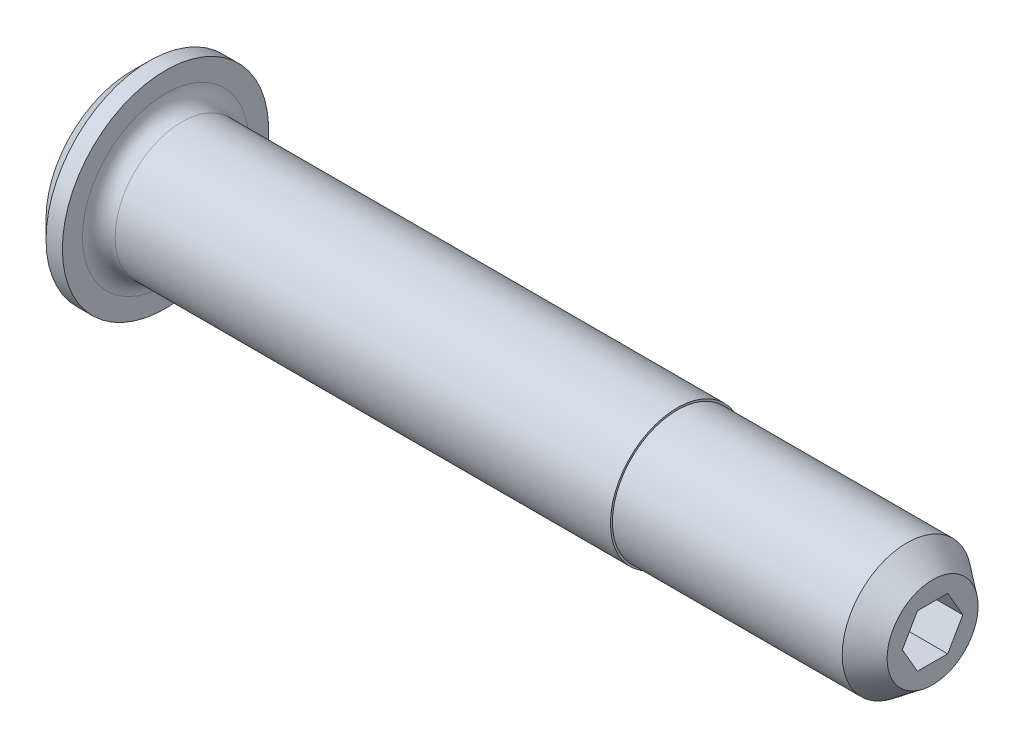
ISO-10303-21;
HEADER;
FILE_DESCRIPTION(('STEP AP214'),'2;1');
FILE_NAME('part.step','',(''),(''),'','','');
FILE_SCHEMA(('AUTOMOTIVE_DESIGN { 1 0 10303 214 1 1 1 1 }'));
ENDSEC;
DATA;
#1=APPLICATION_CONTEXT('core data for automotive mechanical design processes');
#2=APPLICATION_PROTOCOL_DEFINITION('international standard','automotive_design',2000,#1);
#3=PRODUCT_CONTEXT('',#1,'mechanical');
#4=PRODUCT('Part','Part','',(#3));
#5=PRODUCT_RELATED_PRODUCT_CATEGORY('part','',(#4));
#6=PRODUCT_DEFINITION_FORMATION('','',#4);
#7=PRODUCT_DEFINITION_CONTEXT('part definition',#1,'design');
#8=PRODUCT_DEFINITION('design','',#6,#7);
#9=PRODUCT_DEFINITION_SHAPE('','',#8);
#10=(LENGTH_UNIT() NAMED_UNIT(*) SI_UNIT(.MILLI.,.METRE.));
#11=(NAMED_UNIT(*) PLANE_ANGLE_UNIT() SI_UNIT($,.RADIAN.));
#12=(NAMED_UNIT(*) SI_UNIT($,.STERADIAN.) SOLID_ANGLE_UNIT());
#13=UNCERTAINTY_MEASURE_WITH_UNIT(LENGTH_MEASURE(1.E-05),#10,'distance_accuracy_value','');
#14=(GEOMETRIC_REPRESENTATION_CONTEXT(3) GLOBAL_UNCERTAINTY_ASSIGNED_CONTEXT((#13)) GLOBAL_UNIT_ASSIGNED_CONTEXT((#10,
#11,#12)) REPRESENTATION_CONTEXT('',''));
#15=CARTESIAN_POINT('',(0.,0.,0.));
#16=DIRECTION('',(0.,0.,1.));
#17=DIRECTION('',(1.,0.,0.));
#18=AXIS2_PLACEMENT_3D('',#15,#16,#17);
#19=CARTESIAN_POINT('',(21.6916,0.,0.938540597594654));
#20=DIRECTION('',(0.,-0.50000000000001,-0.866025403784433));
#21=DIRECTION('',(0.,-0.866025403784433,0.50000000000001));
#22=AXIS2_PLACEMENT_3D('',#19,#20,#21);
#23=PLANE('',#22);
#24=DIRECTION('',(0.,0.866025403784433,-0.50000000000001));
#25=VECTOR('',#24,1.);
#26=CARTESIAN_POINT('',(24.8666,0.,0.938540597594654));
#27=LINE('',#26,#25);
#28=CARTESIAN_POINT('',(24.8666,0.,0.938540597594654));
#29=VERTEX_POINT('',#28);
#30=CARTESIAN_POINT('',(24.8666,0.8128,0.469270298797319));
#31=VERTEX_POINT('',#30);
#32=EDGE_CURVE('E171',#29,#31,#27,.T.);
#33=ORIENTED_EDGE('',*,*,#32,.F.);
#34=DIRECTION('',(1.,0.,0.));
#35=VECTOR('',#34,1.);
#36=CARTESIAN_POINT('',(21.6916,0.,0.938540597594654));
#37=LINE('',#36,#35);
#38=CARTESIAN_POINT('',(21.6916,0.,0.938540597594654));
#39=VERTEX_POINT('',#38);
#40=EDGE_CURVE('E9',#39,#29,#37,.T.);
#41=ORIENTED_EDGE('',*,*,#40,.F.);
#42=DIRECTION('',(0.,0.866025403784433,-0.50000000000001));
#43=VECTOR('',#42,1.);
#44=CARTESIAN_POINT('',(21.6916,0.,0.938540597594654));
#45=LINE('',#44,#43);
#46=CARTESIAN_POINT('',(21.6916,0.8128,0.469270298797319));
#47=VERTEX_POINT('',#46);
#48=EDGE_CURVE('E125',#39,#47,#45,.T.);
#49=ORIENTED_EDGE('',*,*,#48,.T.);
#50=DIRECTION('',(1.,0.,0.));
#51=VECTOR('',#50,1.);
#52=CARTESIAN_POINT('',(21.6916,0.8128,0.469270298797325));
#53=LINE('',#52,#51);
#54=EDGE_CURVE('E180',#47,#31,#53,.T.);
#55=ORIENTED_EDGE('',*,*,#54,.T.);
#56=EDGE_LOOP('',(#33,#41,#49,#55));
#57=FACE_BOUND('',#56,.T.);
#58=ADVANCED_FACE('F14',(#57),#23,.T.);
#59=CARTESIAN_POINT('',(21.6916,-0.8128,0.469270298797337));
#60=DIRECTION('',(0.,0.499999999999992,-0.866025403784443));
#61=DIRECTION('',(-1.,0.,0.));
#62=AXIS2_PLACEMENT_3D('',#59,#60,#61);
#63=PLANE('',#62);
#64=DIRECTION('',(0.,0.866025403784443,0.499999999999992));
#65=VECTOR('',#64,1.);
#66=CARTESIAN_POINT('',(24.8666,-0.8128,0.469270298797337));
#67=LINE('',#66,#65);
#68=CARTESIAN_POINT('',(24.8666,-0.8128,0.469270298797337));
#69=VERTEX_POINT('',#68);
#70=EDGE_CURVE('E108',#69,#29,#67,.T.);
#71=ORIENTED_EDGE('',*,*,#70,.F.);
#72=DIRECTION('',(1.,0.,0.));
#73=VECTOR('',#72,1.);
#74=CARTESIAN_POINT('',(21.6916,-0.8128,0.469270298797325));
#75=LINE('',#74,#73);
#76=CARTESIAN_POINT('',(21.6916,-0.8128,0.469270298797325));
#77=VERTEX_POINT('',#76);
#78=EDGE_CURVE('E24',#77,#69,#75,.T.);
#79=ORIENTED_EDGE('',*,*,#78,.F.);
#80=DIRECTION('',(0.,0.866025403784443,0.499999999999992));
#81=VECTOR('',#80,1.);
#82=CARTESIAN_POINT('',(21.6916,-0.8128,0.469270298797337));
#83=LINE('',#82,#81);
#84=EDGE_CURVE('E105',#77,#39,#83,.T.);
#85=ORIENTED_EDGE('',*,*,#84,.T.);
#86=ORIENTED_EDGE('',*,*,#40,.T.);
#87=EDGE_LOOP('',(#71,#79,#85,#86));
#88=FACE_BOUND('',#87,.T.);
#89=ADVANCED_FACE('F103',(#88),#63,.T.);
#90=CARTESIAN_POINT('',(21.6916,-0.8128,-0.469270298797325));
#91=DIRECTION('',(0.,1.,0.));
#92=DIRECTION('',(1.,0.,0.));
#93=AXIS2_PLACEMENT_3D('',#90,#91,#92);
#94=PLANE('',#93);
#95=DIRECTION('',(0.,0.,1.));
#96=VECTOR('',#95,1.);
#97=CARTESIAN_POINT('',(24.8666,-0.8128,-0.469270298797325));
#98=LINE('',#97,#96);
#99=CARTESIAN_POINT('',(24.8666,-0.8128,-0.469270298797325));
#100=VERTEX_POINT('',#99);
#101=EDGE_CURVE('E149',#100,#69,#98,.T.);
#102=ORIENTED_EDGE('',*,*,#101,.F.);
#103=DIRECTION('',(1.,0.,0.));
#104=VECTOR('',#103,1.);
#105=CARTESIAN_POINT('',(21.6916,-0.8128,-0.469270298797325));
#106=LINE('',#105,#104);
#107=CARTESIAN_POINT('',(21.6916,-0.8128,-0.469270298797325));
#108=VERTEX_POINT('',#107);
#109=EDGE_CURVE('E17',#108,#100,#106,.T.);
#110=ORIENTED_EDGE('',*,*,#109,.F.);
#111=DIRECTION('',(0.,0.,1.));
#112=VECTOR('',#111,1.);
#113=CARTESIAN_POINT('',(21.6916,-0.8128,-0.469270298797325));
#114=LINE('',#113,#112);
#115=EDGE_CURVE('E115',#108,#77,#114,.T.);
#116=ORIENTED_EDGE('',*,*,#115,.T.);
#117=ORIENTED_EDGE('',*,*,#78,.T.);
#118=EDGE_LOOP('',(#102,#110,#116,#117));
#119=FACE_BOUND('',#118,.T.);
#120=ADVANCED_FACE('F116',(#119),#94,.T.);
#121=CARTESIAN_POINT('',(21.6916,0.,-0.938540597594654));
#122=DIRECTION('',(0.,0.5,0.866025403784436));
#123=DIRECTION('',(1.,0.,0.));
#124=AXIS2_PLACEMENT_3D('',#121,#122,#123);
#125=PLANE('',#124);
#126=DIRECTION('',(0.,-0.866025403784436,0.5));
#127=VECTOR('',#126,1.);
#128=CARTESIAN_POINT('',(24.8666,0.,-0.938540597594654));
#129=LINE('',#128,#127);
#130=CARTESIAN_POINT('',(24.8666,0.,-0.938540597594654));
#131=VERTEX_POINT('',#130);
#132=EDGE_CURVE('E147',#131,#100,#129,.T.);
#133=ORIENTED_EDGE('',*,*,#132,.F.);
#134=DIRECTION('',(1.,0.,0.));
#135=VECTOR('',#134,1.);
#136=CARTESIAN_POINT('',(21.6916,0.,-0.938540597594654));
#137=LINE('',#136,#135);
#138=CARTESIAN_POINT('',(21.6916,0.,-0.938540597594654));
#139=VERTEX_POINT('',#138);
#140=EDGE_CURVE('E38',#139,#131,#137,.T.);
#141=ORIENTED_EDGE('',*,*,#140,.F.);
#142=DIRECTION('',(0.,-0.866025403784436,0.5));
#143=VECTOR('',#142,1.);
#144=CARTESIAN_POINT('',(21.6916,0.,-0.938540597594654));
#145=LINE('',#144,#143);
#146=EDGE_CURVE('E120',#139,#108,#145,.T.);
#147=ORIENTED_EDGE('',*,*,#146,.T.);
#148=ORIENTED_EDGE('',*,*,#109,.T.);
#149=EDGE_LOOP('',(#133,#141,#147,#148));
#150=FACE_BOUND('',#149,.T.);
#151=ADVANCED_FACE('F145',(#150),#125,.T.);
#152=CARTESIAN_POINT('',(21.6916,0.8128,-0.469270298797331));
#153=DIRECTION('',(0.,-0.5,0.86602540378444));
#154=DIRECTION('',(-1.,0.,0.));
#155=AXIS2_PLACEMENT_3D('',#152,#153,#154);
#156=PLANE('',#155);
#157=DIRECTION('',(0.,-0.86602540378444,-0.5));
#158=VECTOR('',#157,1.);
#159=CARTESIAN_POINT('',(24.8666,0.8128,-0.469270298797331));
#160=LINE('',#159,#158);
#161=CARTESIAN_POINT('',(24.8666,0.8128,-0.469270298797331));
#162=VERTEX_POINT('',#161);
#163=EDGE_CURVE('E156',#162,#131,#160,.T.);
#164=ORIENTED_EDGE('',*,*,#163,.F.);
#165=DIRECTION('',(1.,0.,0.));
#166=VECTOR('',#165,1.);
#167=CARTESIAN_POINT('',(21.6916,0.8128,-0.469270298797325));
#168=LINE('',#167,#166);
#169=CARTESIAN_POINT('',(21.6916,0.8128,-0.469270298797331));
#170=VERTEX_POINT('',#169);
#171=EDGE_CURVE('E131',#170,#162,#168,.T.);
#172=ORIENTED_EDGE('',*,*,#171,.F.);
#173=DIRECTION('',(0.,-0.86602540378444,-0.5));
#174=VECTOR('',#173,1.);
#175=CARTESIAN_POINT('',(21.6916,0.8128,-0.469270298797331));
#176=LINE('',#175,#174);
#177=EDGE_CURVE('E137',#170,#139,#176,.T.);
#178=ORIENTED_EDGE('',*,*,#177,.T.);
#179=ORIENTED_EDGE('',*,*,#140,.T.);
#180=EDGE_LOOP('',(#164,#172,#178,#179));
#181=FACE_BOUND('',#180,.T.);
#182=ADVANCED_FACE('F212',(#181),#156,.T.);
#183=CARTESIAN_POINT('',(21.6916,0.,0.));
#184=DIRECTION('',(-1.,0.,0.));
#185=DIRECTION('',(0.,0.,1.));
#186=AXIS2_PLACEMENT_3D('',#183,#184,#185);
#187=PLANE('',#186);
#188=DIRECTION('',(0.,0.,-1.));
#189=VECTOR('',#188,1.);
#190=CARTESIAN_POINT('',(21.6916,0.8128,0.469270298797325));
#191=LINE('',#190,#189);
#192=EDGE_CURVE('E199',#47,#170,#191,.T.);
#193=ORIENTED_EDGE('',*,*,#192,.F.);
#194=ORIENTED_EDGE('',*,*,#48,.F.);
#195=ORIENTED_EDGE('',*,*,#84,.F.);
#196=ORIENTED_EDGE('',*,*,#115,.F.);
#197=ORIENTED_EDGE('',*,*,#146,.F.);
#198=ORIENTED_EDGE('',*,*,#177,.F.);
#199=EDGE_LOOP('',(#193,#194,#195,#196,#197,#198));
#200=FACE_BOUND('',#199,.T.);
#201=ADVANCED_FACE('F123',(#200),#187,.F.);
#202=CARTESIAN_POINT('',(21.6916,0.8128,0.469270298797325));
#203=DIRECTION('',(0.,-1.,0.));
#204=DIRECTION('',(0.,0.,-1.));
#205=AXIS2_PLACEMENT_3D('',#202,#203,#204);
#206=PLANE('',#205);
#207=DIRECTION('',(0.,0.,-1.));
#208=VECTOR('',#207,1.);
#209=CARTESIAN_POINT('',(24.8666,0.8128,0.469270298797325));
#210=LINE('',#209,#208);
#211=EDGE_CURVE('E176',#31,#162,#210,.T.);
#212=ORIENTED_EDGE('',*,*,#211,.F.);
#213=ORIENTED_EDGE('',*,*,#54,.F.);
#214=ORIENTED_EDGE('',*,*,#192,.T.);
#215=ORIENTED_EDGE('',*,*,#171,.T.);
#216=EDGE_LOOP('',(#212,#213,#214,#215));
#217=FACE_BOUND('',#216,.T.);
#218=ADVANCED_FACE('F208',(#217),#206,.T.);
#219=CARTESIAN_POINT('',(0.,0.,0.));
#220=DIRECTION('',(1.,0.,0.));
#221=DIRECTION('',(0.,1.,0.));
#222=AXIS2_PLACEMENT_3D('',#219,#220,#221);
#223=PLANE('',#222);
#224=CARTESIAN_POINT('',(0.,0.,0.));
#225=DIRECTION('',(-1.,0.,0.));
#226=DIRECTION('',(0.,0.,1.));
#227=AXIS2_PLACEMENT_3D('',#224,#225,#226);
#228=CIRCLE('',#227,2.6416);
#229=CARTESIAN_POINT('',(0.,0.,2.6416));
#230=VERTEX_POINT('',#229);
#231=EDGE_CURVE('E177',#230,#230,#228,.T.);
#232=ORIENTED_EDGE('',*,*,#231,.T.);
#233=EDGE_LOOP('',(#232));
#234=FACE_BOUND('',#233,.T.);
#235=ADVANCED_FACE('F288',(#234),#223,.F.);
#236=CARTESIAN_POINT('',(0.558800000000082,0.,0.));
#237=DIRECTION('',(1.,0.,0.));
#238=DIRECTION('',(0.,0.,-1.));
#239=AXIS2_PLACEMENT_3D('',#236,#237,#238);
#240=CONICAL_SURFACE('',#239,3.2004,0.78539816339738);
#241=ORIENTED_EDGE('',*,*,#231,.F.);
#242=EDGE_LOOP('',(#241));
#243=FACE_BOUND('',#242,.T.);
#244=CARTESIAN_POINT('',(0.558800000000082,0.,0.));
#245=DIRECTION('',(-1.,0.,0.));
#246=DIRECTION('',(0.,0.,1.));
#247=AXIS2_PLACEMENT_3D('',#244,#245,#246);
#248=CIRCLE('',#247,3.2004);
#249=CARTESIAN_POINT('',(0.558800000000082,0.,3.2004));
#250=VERTEX_POINT('',#249);
#251=EDGE_CURVE('E181',#250,#250,#248,.T.);
#252=ORIENTED_EDGE('',*,*,#251,.T.);
#253=EDGE_LOOP('',(#252));
#254=FACE_BOUND('',#253,.T.);
#255=ADVANCED_FACE('F285',(#243,#254),#240,.T.);
#256=CARTESIAN_POINT('',(-1000.,0.,0.));
#257=DIRECTION('',(-1.,0.,0.));
#258=DIRECTION('',(0.,0.,1.));
#259=AXIS2_PLACEMENT_3D('',#256,#257,#258);
#260=CYLINDRICAL_SURFACE('',#259,3.2004);
#261=ORIENTED_EDGE('',*,*,#251,.F.);
#262=EDGE_LOOP('',(#261));
#263=FACE_BOUND('',#262,.T.);
#264=CARTESIAN_POINT('',(1.06680000000003,0.,0.));
#265=DIRECTION('',(-1.,0.,0.));
#266=DIRECTION('',(0.,0.,1.));
#267=AXIS2_PLACEMENT_3D('',#264,#265,#266);
#268=CIRCLE('',#267,3.2004);
#269=CARTESIAN_POINT('',(1.06680000000003,0.,3.2004));
#270=VERTEX_POINT('',#269);
#271=EDGE_CURVE('E191',#270,#270,#268,.T.);
#272=ORIENTED_EDGE('',*,*,#271,.T.);
#273=EDGE_LOOP('',(#272));
#274=FACE_BOUND('',#273,.T.);
#275=ADVANCED_FACE('F283',(#263,#274),#260,.T.);
#276=CARTESIAN_POINT('',(1.0668,3.2004,0.));
#277=DIRECTION('',(-1.,0.,0.));
#278=DIRECTION('',(0.,0.,1.));
#279=AXIS2_PLACEMENT_3D('',#276,#277,#278);
#280=PLANE('',#279);
#281=CARTESIAN_POINT('',(1.06680000000003,0.,0.));
#282=DIRECTION('',(-1.,0.,0.));
#283=DIRECTION('',(0.,0.,1.));
#284=AXIS2_PLACEMENT_3D('',#281,#282,#283);
#285=CIRCLE('',#284,2.5781);
#286=CARTESIAN_POINT('',(1.06680000000003,0.,2.5781));
#287=VERTEX_POINT('',#286);
#288=EDGE_CURVE('E187',#287,#287,#285,.T.);
#289=ORIENTED_EDGE('',*,*,#288,.T.);
#290=EDGE_LOOP('',(#289));
#291=FACE_BOUND('',#290,.T.);
#292=ORIENTED_EDGE('',*,*,#271,.F.);
#293=EDGE_LOOP('',(#292));
#294=FACE_BOUND('',#293,.T.);
#295=ADVANCED_FACE('F279',(#291,#294),#280,.F.);
#296=CARTESIAN_POINT('',(1.5748,0.,0.));
#297=DIRECTION('',(-1.,0.,0.));
#298=DIRECTION('',(0.,0.,1.));
#299=AXIS2_PLACEMENT_3D('',#296,#297,#298);
#300=TOROIDAL_SURFACE('',#299,2.5781,0.508);
#301=ORIENTED_EDGE('',*,*,#288,.F.);
#302=EDGE_LOOP('',(#301));
#303=FACE_BOUND('',#302,.T.);
#304=CARTESIAN_POINT('',(1.5748,0.,0.));
#305=DIRECTION('',(-1.,0.,0.));
#306=DIRECTION('',(0.,0.,1.));
#307=AXIS2_PLACEMENT_3D('',#304,#305,#306);
#308=CIRCLE('',#307,2.0701);
#309=CARTESIAN_POINT('',(1.5748,0.,2.0701));
#310=VERTEX_POINT('',#309);
#311=EDGE_CURVE('E165',#310,#310,#308,.T.);
#312=ORIENTED_EDGE('',*,*,#311,.T.);
#313=EDGE_LOOP('',(#312));
#314=FACE_BOUND('',#313,.T.);
#315=ADVANCED_FACE('F275',(#303,#314),#300,.F.);
#316=CARTESIAN_POINT('',(-1000.,0.,0.));
#317=DIRECTION('',(-1.,0.,0.));
#318=DIRECTION('',(0.,0.,1.));
#319=AXIS2_PLACEMENT_3D('',#316,#317,#318);
#320=CYLINDRICAL_SURFACE('',#319,2.0701);
#321=ORIENTED_EDGE('',*,*,#311,.F.);
#322=EDGE_LOOP('',(#321));
#323=FACE_BOUND('',#322,.T.);
#324=CARTESIAN_POINT('',(16.9418,0.,0.));
#325=DIRECTION('',(-1.,0.,0.));
#326=DIRECTION('',(0.,0.,1.));
#327=AXIS2_PLACEMENT_3D('',#324,#325,#326);
#328=CIRCLE('',#327,2.0701);
#329=CARTESIAN_POINT('',(16.9418,0.,2.0701));
#330=VERTEX_POINT('',#329);
#331=EDGE_CURVE('E166',#330,#330,#328,.T.);
#332=ORIENTED_EDGE('',*,*,#331,.T.);
#333=EDGE_LOOP('',(#332));
#334=FACE_BOUND('',#333,.T.);
#335=ADVANCED_FACE('F270',(#323,#334),#320,.T.);
#336=CARTESIAN_POINT('',(16.9418,2.0701,0.));
#337=DIRECTION('',(-1.,0.,0.));
#338=DIRECTION('',(0.,0.,1.));
#339=AXIS2_PLACEMENT_3D('',#336,#337,#338);
#340=PLANE('',#339);
#341=CARTESIAN_POINT('',(16.9418,0.,0.));
#342=DIRECTION('',(-1.,0.,0.));
#343=DIRECTION('',(0.,0.,1.));
#344=AXIS2_PLACEMENT_3D('',#341,#342,#343);
#345=CIRCLE('',#344,2.009775);
#346=CARTESIAN_POINT('',(16.9418,0.,2.009775));
#347=VERTEX_POINT('',#346);
#348=EDGE_CURVE('E169',#347,#347,#345,.T.);
#349=ORIENTED_EDGE('',*,*,#348,.T.);
#350=EDGE_LOOP('',(#349));
#351=FACE_BOUND('',#350,.T.);
#352=ORIENTED_EDGE('',*,*,#331,.F.);
#353=EDGE_LOOP('',(#352));
#354=FACE_BOUND('',#353,.T.);
#355=ADVANCED_FACE('F245',(#351,#354),#340,.F.);
#356=CARTESIAN_POINT('',(-1000.,0.,0.));
#357=DIRECTION('',(-1.,0.,0.));
#358=DIRECTION('',(0.,0.,1.));
#359=AXIS2_PLACEMENT_3D('',#356,#357,#358);
#360=CYLINDRICAL_SURFACE('',#359,2.009775);
#361=ORIENTED_EDGE('',*,*,#348,.F.);
#362=EDGE_LOOP('',(#361));
#363=FACE_BOUND('',#362,.T.);
#364=CARTESIAN_POINT('',(24.07285,0.,0.));
#365=DIRECTION('',(-1.,0.,0.));
#366=DIRECTION('',(0.,0.,1.));
#367=AXIS2_PLACEMENT_3D('',#364,#365,#366);
#368=CIRCLE('',#367,2.009775);
#369=CARTESIAN_POINT('',(24.07285,0.,2.009775));
#370=VERTEX_POINT('',#369);
#371=EDGE_CURVE('E184',#370,#370,#368,.T.);
#372=ORIENTED_EDGE('',*,*,#371,.T.);
#373=EDGE_LOOP('',(#372));
#374=FACE_BOUND('',#373,.T.);
#375=ADVANCED_FACE('F263',(#363,#374),#360,.T.);
#376=CARTESIAN_POINT('',(24.8666,0.,0.));
#377=DIRECTION('',(-1.,0.,0.));
#378=DIRECTION('',(0.,0.,1.));
#379=AXIS2_PLACEMENT_3D('',#376,#377,#378);
#380=CONICAL_SURFACE('',#379,1.41164147273091,0.645771823237948);
#381=CARTESIAN_POINT('',(24.8666,0.,0.));
#382=DIRECTION('',(-1.,0.,0.));
#383=DIRECTION('',(0.,0.,1.));
#384=AXIS2_PLACEMENT_3D('',#381,#382,#383);
#385=CIRCLE('',#384,1.41164147273091);
#386=CARTESIAN_POINT('',(24.8666,0.,1.41164147273091));
#387=VERTEX_POINT('',#386);
#388=EDGE_CURVE('E161',#387,#387,#385,.T.);
#389=ORIENTED_EDGE('',*,*,#388,.T.);
#390=EDGE_LOOP('',(#389));
#391=FACE_BOUND('',#390,.T.);
#392=ORIENTED_EDGE('',*,*,#371,.F.);
#393=EDGE_LOOP('',(#392));
#394=FACE_BOUND('',#393,.T.);
#395=ADVANCED_FACE('F256',(#391,#394),#380,.T.);
#396=CARTESIAN_POINT('',(24.8666,1.41164147273091,0.));
#397=DIRECTION('',(-1.,0.,0.));
#398=DIRECTION('',(0.,0.,1.));
#399=AXIS2_PLACEMENT_3D('',#396,#397,#398);
#400=PLANE('',#399);
#401=ORIENTED_EDGE('',*,*,#163,.T.);
#402=ORIENTED_EDGE('',*,*,#132,.T.);
#403=ORIENTED_EDGE('',*,*,#101,.T.);
#404=ORIENTED_EDGE('',*,*,#70,.T.);
#405=ORIENTED_EDGE('',*,*,#32,.T.);
#406=ORIENTED_EDGE('',*,*,#211,.T.);
#407=EDGE_LOOP('',(#401,#402,#403,#404,#405,#406));
#408=FACE_BOUND('',#407,.T.);
#409=ORIENTED_EDGE('',*,*,#388,.F.);
#410=EDGE_LOOP('',(#409));
#411=FACE_BOUND('',#410,.T.);
#412=ADVANCED_FACE('F153',(#408,#411),#400,.F.);
#413=CLOSED_SHELL('',(#58,#89,#120,#151,#182,#201,#218,#235,#255,#275,#295,#315,#335,#355,#375,
#395,#412));
#414=MANIFOLD_SOLID_BREP('B1',#413);
#415=ADVANCED_BREP_SHAPE_REPRESENTATION('',(#18,#414),#14);
#416=SHAPE_DEFINITION_REPRESENTATION(#9,#415);
ENDSEC;
END-ISO-10303-21;
